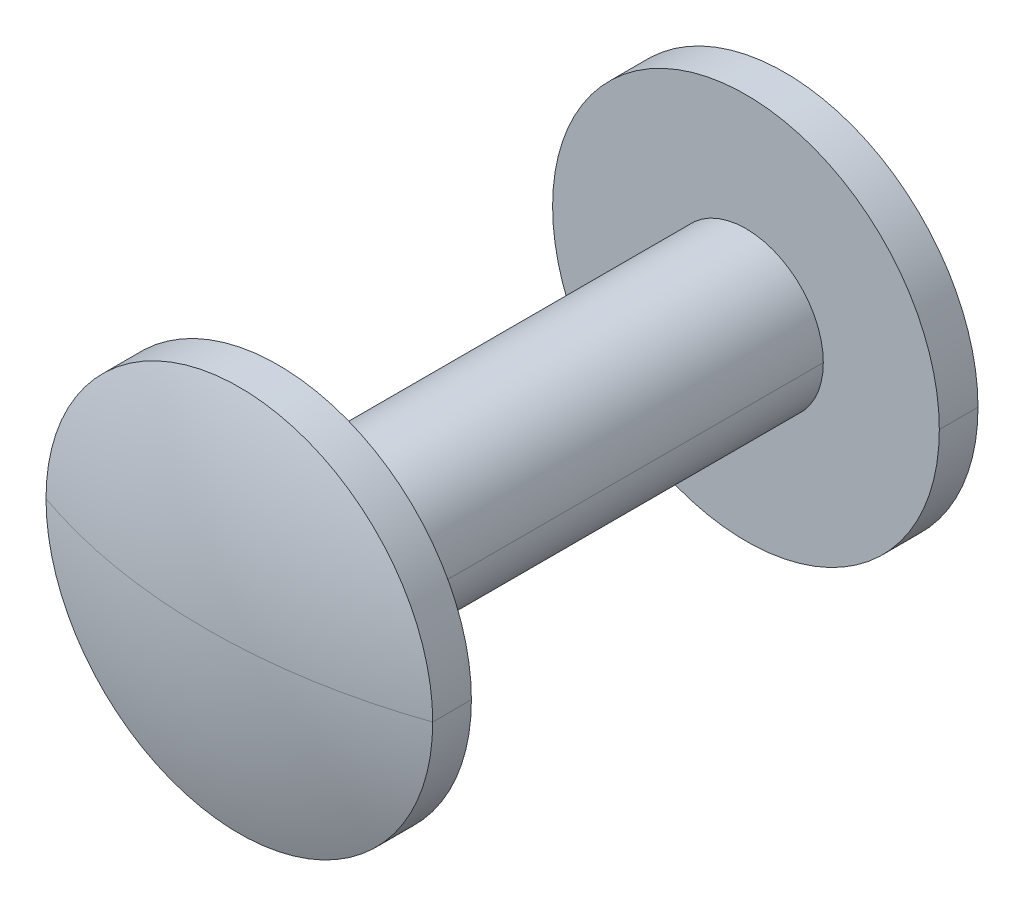
ISO-10303-21;
HEADER;
FILE_DESCRIPTION(('STEP AP214'),'2;1');
FILE_NAME('part.step','',(''),(''),'','','');
FILE_SCHEMA(('AUTOMOTIVE_DESIGN { 1 0 10303 214 1 1 1 1 }'));
ENDSEC;
DATA;
#1=APPLICATION_CONTEXT('core data for automotive mechanical design processes');
#2=APPLICATION_PROTOCOL_DEFINITION('international standard','automotive_design',2000,#1);
#3=PRODUCT_CONTEXT('',#1,'mechanical');
#4=PRODUCT('Part','Part','',(#3));
#5=PRODUCT_RELATED_PRODUCT_CATEGORY('part','',(#4));
#6=PRODUCT_DEFINITION_FORMATION('','',#4);
#7=PRODUCT_DEFINITION_CONTEXT('part definition',#1,'design');
#8=PRODUCT_DEFINITION('design','',#6,#7);
#9=PRODUCT_DEFINITION_SHAPE('','',#8);
#10=(LENGTH_UNIT() NAMED_UNIT(*) SI_UNIT(.MILLI.,.METRE.));
#11=(NAMED_UNIT(*) PLANE_ANGLE_UNIT() SI_UNIT($,.RADIAN.));
#12=(NAMED_UNIT(*) SI_UNIT($,.STERADIAN.) SOLID_ANGLE_UNIT());
#13=UNCERTAINTY_MEASURE_WITH_UNIT(LENGTH_MEASURE(1.E-05),#10,'distance_accuracy_value','');
#14=(GEOMETRIC_REPRESENTATION_CONTEXT(3) GLOBAL_UNCERTAINTY_ASSIGNED_CONTEXT((#13)) GLOBAL_UNIT_ASSIGNED_CONTEXT((#10,
#11,#12)) REPRESENTATION_CONTEXT('',''));
#15=CARTESIAN_POINT('',(0.,0.,0.));
#16=DIRECTION('',(0.,0.,1.));
#17=DIRECTION('',(1.,0.,0.));
#18=AXIS2_PLACEMENT_3D('',#15,#16,#17);
#19=CARTESIAN_POINT('',(1.,0.,-6.972575705));
#20=DIRECTION('',(0.,0.,-1.));
#21=DIRECTION('',(-1.,0.,0.));
#22=AXIS2_PLACEMENT_3D('',#19,#20,#21);
#23=CYLINDRICAL_SURFACE('',#22,2.5);
#24=DIRECTION('',(0.,0.,-1.));
#25=VECTOR('',#24,1.);
#26=CARTESIAN_POINT('',(3.5,0.,-6.972575705));
#27=LINE('',#26,#25);
#28=CARTESIAN_POINT('',(3.5,0.,-6.05));
#29=VERTEX_POINT('',#28);
#30=CARTESIAN_POINT('',(3.5,0.,-6.55));
#31=VERTEX_POINT('',#30);
#32=EDGE_CURVE('E125',#29,#31,#27,.T.);
#33=ORIENTED_EDGE('',*,*,#32,.F.);
#34=CARTESIAN_POINT('',(1.,0.,-6.05));
#35=DIRECTION('',(0.,0.,-1.));
#36=DIRECTION('',(-1.,0.,0.));
#37=AXIS2_PLACEMENT_3D('',#34,#35,#36);
#38=CIRCLE('',#37,2.5);
#39=CARTESIAN_POINT('',(-1.5,0.,-6.05));
#40=VERTEX_POINT('',#39);
#41=EDGE_CURVE('E138',#29,#40,#38,.T.);
#42=ORIENTED_EDGE('',*,*,#41,.T.);
#43=DIRECTION('',(0.,0.,-1.));
#44=VECTOR('',#43,1.);
#45=CARTESIAN_POINT('',(-1.5,0.,-6.972575705));
#46=LINE('',#45,#44);
#47=CARTESIAN_POINT('',(-1.49999999774007,0.,-6.55));
#48=VERTEX_POINT('',#47);
#49=EDGE_CURVE('E120',#40,#48,#46,.T.);
#50=ORIENTED_EDGE('',*,*,#49,.T.);
#51=CARTESIAN_POINT('',(1.,0.,-6.55));
#52=DIRECTION('',(0.,0.,-1.));
#53=DIRECTION('',(-1.,0.,0.));
#54=AXIS2_PLACEMENT_3D('',#51,#52,#53);
#55=CIRCLE('',#54,2.5);
#56=EDGE_CURVE('E21',#31,#48,#55,.T.);
#57=ORIENTED_EDGE('',*,*,#56,.F.);
#58=EDGE_LOOP('',(#33,#42,#50,#57));
#59=FACE_BOUND('',#58,.T.);
#60=ADVANCED_FACE('F17',(#59),#23,.T.);
#61=CARTESIAN_POINT('',(1.00000000225994,0.,0.633836754462804));
#62=DIRECTION('',(0.,-1.,0.));
#63=DIRECTION('',(1.,0.,0.));
#64=AXIS2_PLACEMENT_3D('',#61,#62,#63);
#65=SPHERICAL_SURFACE('',#64,7.6064124594628);
#66=CARTESIAN_POINT('',(1.00000000225994,0.,0.633836754462804));
#67=DIRECTION('',(0.,-1.,0.));
#68=DIRECTION('',(1.,0.,0.));
#69=AXIS2_PLACEMENT_3D('',#66,#67,#68);
#70=CIRCLE('',#69,7.6064124594628);
#71=CARTESIAN_POINT('',(1.00000000225994,0.,-6.972575705));
#72=VERTEX_POINT('',#71);
#73=EDGE_CURVE('E131',#48,#72,#70,.T.);
#74=ORIENTED_EDGE('',*,*,#73,.F.);
#75=CARTESIAN_POINT('',(1.,0.,-6.55));
#76=DIRECTION('',(0.,0.,-1.));
#77=DIRECTION('',(-1.,0.,0.));
#78=AXIS2_PLACEMENT_3D('',#75,#76,#77);
#79=CIRCLE('',#78,2.5);
#80=EDGE_CURVE('E130',#48,#31,#79,.T.);
#81=ORIENTED_EDGE('',*,*,#80,.T.);
#82=CARTESIAN_POINT('',(1.00000000225994,0.,0.633836754462804));
#83=DIRECTION('',(0.,1.,0.));
#84=DIRECTION('',(0.,0.,1.));
#85=AXIS2_PLACEMENT_3D('',#82,#83,#84);
#86=CIRCLE('',#85,7.6064124594628);
#87=EDGE_CURVE('E117',#31,#72,#86,.T.);
#88=ORIENTED_EDGE('',*,*,#87,.T.);
#89=EDGE_LOOP('',(#74,#81,#88));
#90=FACE_BOUND('',#89,.T.);
#91=ADVANCED_FACE('F209',(#90),#65,.T.);
#92=CARTESIAN_POINT('',(1.00000000225994,0.,-6.6838367544628));
#93=DIRECTION('',(0.,1.,0.));
#94=DIRECTION('',(-1.,0.,0.));
#95=AXIS2_PLACEMENT_3D('',#92,#93,#94);
#96=SPHERICAL_SURFACE('',#95,7.6064124594628);
#97=CARTESIAN_POINT('',(1.00000000225994,0.,-6.6838367544628));
#98=DIRECTION('',(0.,1.,0.));
#99=DIRECTION('',(-1.,0.,0.));
#100=AXIS2_PLACEMENT_3D('',#97,#98,#99);
#101=CIRCLE('',#100,7.6064124594628);
#102=CARTESIAN_POINT('',(1.00000000225994,0.,0.922575705000001));
#103=VERTEX_POINT('',#102);
#104=CARTESIAN_POINT('',(3.5,0.,0.5));
#105=VERTEX_POINT('',#104);
#106=EDGE_CURVE('E86',#103,#105,#101,.T.);
#107=ORIENTED_EDGE('',*,*,#106,.F.);
#108=CARTESIAN_POINT('',(1.00000000225994,0.,-6.6838367544628));
#109=DIRECTION('',(0.,-1.,0.));
#110=DIRECTION('',(0.,0.,-1.));
#111=AXIS2_PLACEMENT_3D('',#108,#109,#110);
#112=CIRCLE('',#111,7.6064124594628);
#113=CARTESIAN_POINT('',(-1.5,0.,0.5));
#114=VERTEX_POINT('',#113);
#115=EDGE_CURVE('E88',#103,#114,#112,.T.);
#116=ORIENTED_EDGE('',*,*,#115,.T.);
#117=CARTESIAN_POINT('',(1.,0.,0.5));
#118=DIRECTION('',(0.,0.,-1.));
#119=DIRECTION('',(-1.,0.,0.));
#120=AXIS2_PLACEMENT_3D('',#117,#118,#119);
#121=CIRCLE('',#120,2.5);
#122=EDGE_CURVE('E11',#105,#114,#121,.T.);
#123=ORIENTED_EDGE('',*,*,#122,.F.);
#124=EDGE_LOOP('',(#107,#116,#123));
#125=FACE_BOUND('',#124,.T.);
#126=ADVANCED_FACE('F84',(#125),#96,.T.);
#127=CARTESIAN_POINT('',(1.,0.,-6.972575705));
#128=DIRECTION('',(0.,0.,-1.));
#129=DIRECTION('',(-1.,0.,0.));
#130=AXIS2_PLACEMENT_3D('',#127,#128,#129);
#131=CYLINDRICAL_SURFACE('',#130,2.5);
#132=DIRECTION('',(0.,0.,-1.));
#133=VECTOR('',#132,1.);
#134=CARTESIAN_POINT('',(3.5,0.,-6.972575705));
#135=LINE('',#134,#133);
#136=CARTESIAN_POINT('',(3.5,0.,0.));
#137=VERTEX_POINT('',#136);
#138=EDGE_CURVE('E93',#105,#137,#135,.T.);
#139=ORIENTED_EDGE('',*,*,#138,.F.);
#140=ORIENTED_EDGE('',*,*,#122,.T.);
#141=DIRECTION('',(0.,0.,-1.));
#142=VECTOR('',#141,1.);
#143=CARTESIAN_POINT('',(-1.5,0.,-6.972575705));
#144=LINE('',#143,#142);
#145=CARTESIAN_POINT('',(-1.5,0.,0.));
#146=VERTEX_POINT('',#145);
#147=EDGE_CURVE('E106',#114,#146,#144,.T.);
#148=ORIENTED_EDGE('',*,*,#147,.T.);
#149=CARTESIAN_POINT('',(1.,0.,0.));
#150=DIRECTION('',(0.,0.,-1.));
#151=DIRECTION('',(-1.,0.,0.));
#152=AXIS2_PLACEMENT_3D('',#149,#150,#151);
#153=CIRCLE('',#152,2.5);
#154=EDGE_CURVE('E28',#137,#146,#153,.T.);
#155=ORIENTED_EDGE('',*,*,#154,.F.);
#156=EDGE_LOOP('',(#139,#140,#148,#155));
#157=FACE_BOUND('',#156,.T.);
#158=ADVANCED_FACE('F95',(#157),#131,.T.);
#159=CARTESIAN_POINT('',(2.,0.,0.));
#160=DIRECTION('',(0.,0.,1.));
#161=DIRECTION('',(1.,0.,0.));
#162=AXIS2_PLACEMENT_3D('',#159,#160,#161);
#163=PLANE('',#162);
#164=CARTESIAN_POINT('',(1.,0.,0.));
#165=DIRECTION('',(0.,0.,-1.));
#166=DIRECTION('',(-1.,0.,0.));
#167=AXIS2_PLACEMENT_3D('',#164,#165,#166);
#168=CIRCLE('',#167,1.);
#169=CARTESIAN_POINT('',(0.,0.,0.));
#170=VERTEX_POINT('',#169);
#171=CARTESIAN_POINT('',(2.,0.,0.));
#172=VERTEX_POINT('',#171);
#173=EDGE_CURVE('E157',#170,#172,#168,.T.);
#174=ORIENTED_EDGE('',*,*,#173,.F.);
#175=CARTESIAN_POINT('',(1.,0.,0.));
#176=DIRECTION('',(0.,0.,-1.));
#177=DIRECTION('',(-1.,0.,0.));
#178=AXIS2_PLACEMENT_3D('',#175,#176,#177);
#179=CIRCLE('',#178,1.);
#180=EDGE_CURVE('E140',#172,#170,#179,.T.);
#181=ORIENTED_EDGE('',*,*,#180,.F.);
#182=EDGE_LOOP('',(#174,#181));
#183=FACE_BOUND('',#182,.T.);
#184=CARTESIAN_POINT('',(1.,0.,0.));
#185=DIRECTION('',(0.,0.,-1.));
#186=DIRECTION('',(-1.,0.,0.));
#187=AXIS2_PLACEMENT_3D('',#184,#185,#186);
#188=CIRCLE('',#187,2.5);
#189=EDGE_CURVE('E101',#146,#137,#188,.T.);
#190=ORIENTED_EDGE('',*,*,#189,.T.);
#191=ORIENTED_EDGE('',*,*,#154,.T.);
#192=EDGE_LOOP('',(#190,#191));
#193=FACE_BOUND('',#192,.T.);
#194=ADVANCED_FACE('F178',(#183,#193),#163,.F.);
#195=CARTESIAN_POINT('',(1.,0.,-6.972575705));
#196=DIRECTION('',(0.,0.,-1.));
#197=DIRECTION('',(-1.,0.,0.));
#198=AXIS2_PLACEMENT_3D('',#195,#196,#197);
#199=CYLINDRICAL_SURFACE('',#198,1.);
#200=DIRECTION('',(0.,0.,-1.));
#201=VECTOR('',#200,1.);
#202=CARTESIAN_POINT('',(2.,0.,-6.972575705));
#203=LINE('',#202,#201);
#204=CARTESIAN_POINT('',(2.,0.,-6.05));
#205=VERTEX_POINT('',#204);
#206=EDGE_CURVE('E153',#172,#205,#203,.T.);
#207=ORIENTED_EDGE('',*,*,#206,.F.);
#208=ORIENTED_EDGE('',*,*,#180,.T.);
#209=DIRECTION('',(0.,0.,-1.));
#210=VECTOR('',#209,1.);
#211=CARTESIAN_POINT('',(0.,0.,-6.972575705));
#212=LINE('',#211,#210);
#213=CARTESIAN_POINT('',(0.,0.,-6.05));
#214=VERTEX_POINT('',#213);
#215=EDGE_CURVE('E135',#170,#214,#212,.T.);
#216=ORIENTED_EDGE('',*,*,#215,.T.);
#217=CARTESIAN_POINT('',(1.,0.,-6.05));
#218=DIRECTION('',(0.,0.,-1.));
#219=DIRECTION('',(-1.,0.,0.));
#220=AXIS2_PLACEMENT_3D('',#217,#218,#219);
#221=CIRCLE('',#220,1.);
#222=EDGE_CURVE('E42',#205,#214,#221,.T.);
#223=ORIENTED_EDGE('',*,*,#222,.F.);
#224=EDGE_LOOP('',(#207,#208,#216,#223));
#225=FACE_BOUND('',#224,.T.);
#226=ADVANCED_FACE('F19',(#225),#199,.T.);
#227=CARTESIAN_POINT('',(2.,0.,-6.05));
#228=DIRECTION('',(0.,0.,-1.));
#229=DIRECTION('',(0.,-1.,0.));
#230=AXIS2_PLACEMENT_3D('',#227,#228,#229);
#231=PLANE('',#230);
#232=CARTESIAN_POINT('',(1.,0.,-6.05));
#233=DIRECTION('',(0.,0.,-1.));
#234=DIRECTION('',(-1.,0.,0.));
#235=AXIS2_PLACEMENT_3D('',#232,#233,#234);
#236=CIRCLE('',#235,1.);
#237=EDGE_CURVE('E139',#214,#205,#236,.T.);
#238=ORIENTED_EDGE('',*,*,#237,.T.);
#239=ORIENTED_EDGE('',*,*,#222,.T.);
#240=EDGE_LOOP('',(#238,#239));
#241=FACE_BOUND('',#240,.T.);
#242=CARTESIAN_POINT('',(1.,0.,-6.05));
#243=DIRECTION('',(0.,0.,-1.));
#244=DIRECTION('',(-1.,0.,0.));
#245=AXIS2_PLACEMENT_3D('',#242,#243,#244);
#246=CIRCLE('',#245,2.5);
#247=EDGE_CURVE('E122',#40,#29,#246,.T.);
#248=ORIENTED_EDGE('',*,*,#247,.F.);
#249=ORIENTED_EDGE('',*,*,#41,.F.);
#250=EDGE_LOOP('',(#248,#249));
#251=FACE_BOUND('',#250,.T.);
#252=ADVANCED_FACE('F181',(#241,#251),#231,.F.);
#253=CARTESIAN_POINT('',(1.,0.,-6.972575705));
#254=DIRECTION('',(0.,0.,-1.));
#255=DIRECTION('',(-1.,0.,0.));
#256=AXIS2_PLACEMENT_3D('',#253,#254,#255);
#257=CYLINDRICAL_SURFACE('',#256,1.);
#258=ORIENTED_EDGE('',*,*,#173,.T.);
#259=ORIENTED_EDGE('',*,*,#206,.T.);
#260=ORIENTED_EDGE('',*,*,#237,.F.);
#261=ORIENTED_EDGE('',*,*,#215,.F.);
#262=EDGE_LOOP('',(#258,#259,#260,#261));
#263=FACE_BOUND('',#262,.T.);
#264=ADVANCED_FACE('F171',(#263),#257,.T.);
#265=CARTESIAN_POINT('',(1.,0.,-6.972575705));
#266=DIRECTION('',(0.,0.,-1.));
#267=DIRECTION('',(-1.,0.,0.));
#268=AXIS2_PLACEMENT_3D('',#265,#266,#267);
#269=CYLINDRICAL_SURFACE('',#268,2.5);
#270=CARTESIAN_POINT('',(1.,0.,0.5));
#271=DIRECTION('',(0.,0.,-1.));
#272=DIRECTION('',(-1.,0.,0.));
#273=AXIS2_PLACEMENT_3D('',#270,#271,#272);
#274=CIRCLE('',#273,2.5);
#275=EDGE_CURVE('E102',#114,#105,#274,.T.);
#276=ORIENTED_EDGE('',*,*,#275,.T.);
#277=ORIENTED_EDGE('',*,*,#138,.T.);
#278=ORIENTED_EDGE('',*,*,#189,.F.);
#279=ORIENTED_EDGE('',*,*,#147,.F.);
#280=EDGE_LOOP('',(#276,#277,#278,#279));
#281=FACE_BOUND('',#280,.T.);
#282=ADVANCED_FACE('F105',(#281),#269,.T.);
#283=CARTESIAN_POINT('',(1.00000000225994,0.,-6.6838367544628));
#284=DIRECTION('',(0.,1.,0.));
#285=DIRECTION('',(-1.,0.,0.));
#286=AXIS2_PLACEMENT_3D('',#283,#284,#285);
#287=SPHERICAL_SURFACE('',#286,7.6064124594628);
#288=ORIENTED_EDGE('',*,*,#115,.F.);
#289=ORIENTED_EDGE('',*,*,#106,.T.);
#290=ORIENTED_EDGE('',*,*,#275,.F.);
#291=EDGE_LOOP('',(#288,#289,#290));
#292=FACE_BOUND('',#291,.T.);
#293=ADVANCED_FACE('F110',(#292),#287,.T.);
#294=CARTESIAN_POINT('',(1.00000000225994,0.,0.633836754462804));
#295=DIRECTION('',(0.,-1.,0.));
#296=DIRECTION('',(1.,0.,0.));
#297=AXIS2_PLACEMENT_3D('',#294,#295,#296);
#298=SPHERICAL_SURFACE('',#297,7.6064124594628);
#299=ORIENTED_EDGE('',*,*,#56,.T.);
#300=ORIENTED_EDGE('',*,*,#73,.T.);
#301=ORIENTED_EDGE('',*,*,#87,.F.);
#302=EDGE_LOOP('',(#299,#300,#301));
#303=FACE_BOUND('',#302,.T.);
#304=ADVANCED_FACE('F203',(#303),#298,.T.);
#305=CARTESIAN_POINT('',(1.,0.,-6.972575705));
#306=DIRECTION('',(0.,0.,-1.));
#307=DIRECTION('',(-1.,0.,0.));
#308=AXIS2_PLACEMENT_3D('',#305,#306,#307);
#309=CYLINDRICAL_SURFACE('',#308,2.5);
#310=ORIENTED_EDGE('',*,*,#247,.T.);
#311=ORIENTED_EDGE('',*,*,#32,.T.);
#312=ORIENTED_EDGE('',*,*,#80,.F.);
#313=ORIENTED_EDGE('',*,*,#49,.F.);
#314=EDGE_LOOP('',(#310,#311,#312,#313));
#315=FACE_BOUND('',#314,.T.);
#316=ADVANCED_FACE('F189',(#315),#309,.T.);
#317=CLOSED_SHELL('',(#60,#91,#126,#158,#194,#226,#252,#264,#282,#293,#304,#316));
#318=MANIFOLD_SOLID_BREP('B1',#317);
#319=ADVANCED_BREP_SHAPE_REPRESENTATION('',(#18,#318),#14);
#320=SHAPE_DEFINITION_REPRESENTATION(#9,#319);
ENDSEC;
END-ISO-10303-21;
